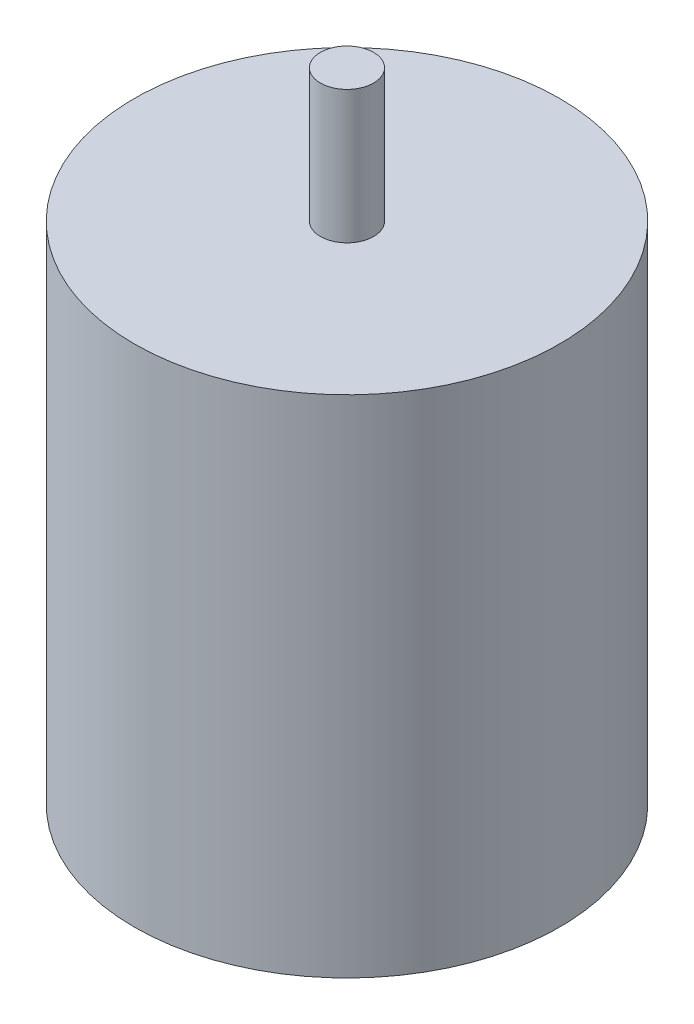
ISO-10303-21;
HEADER;
FILE_DESCRIPTION(('STEP AP214'),'2;1');
FILE_NAME('part.step','',(''),(''),'','','');
FILE_SCHEMA(('AUTOMOTIVE_DESIGN { 1 0 10303 214 1 1 1 1 }'));
ENDSEC;
DATA;
#1=APPLICATION_CONTEXT('core data for automotive mechanical design processes');
#2=APPLICATION_PROTOCOL_DEFINITION('international standard','automotive_design',2000,#1);
#3=PRODUCT_CONTEXT('',#1,'mechanical');
#4=PRODUCT('Part','Part','',(#3));
#5=PRODUCT_RELATED_PRODUCT_CATEGORY('part','',(#4));
#6=PRODUCT_DEFINITION_FORMATION('','',#4);
#7=PRODUCT_DEFINITION_CONTEXT('part definition',#1,'design');
#8=PRODUCT_DEFINITION('design','',#6,#7);
#9=PRODUCT_DEFINITION_SHAPE('','',#8);
#10=(LENGTH_UNIT() NAMED_UNIT(*) SI_UNIT(.MILLI.,.METRE.));
#11=(NAMED_UNIT(*) PLANE_ANGLE_UNIT() SI_UNIT($,.RADIAN.));
#12=(NAMED_UNIT(*) SI_UNIT($,.STERADIAN.) SOLID_ANGLE_UNIT());
#13=UNCERTAINTY_MEASURE_WITH_UNIT(LENGTH_MEASURE(1.E-05),#10,'distance_accuracy_value','');
#14=(GEOMETRIC_REPRESENTATION_CONTEXT(3) GLOBAL_UNCERTAINTY_ASSIGNED_CONTEXT((#13)) GLOBAL_UNIT_ASSIGNED_CONTEXT((#10,
#11,#12)) REPRESENTATION_CONTEXT('',''));
#15=CARTESIAN_POINT('',(0.,0.,0.));
#16=DIRECTION('',(0.,0.,1.));
#17=DIRECTION('',(1.,0.,0.));
#18=AXIS2_PLACEMENT_3D('',#15,#16,#17);
#19=CARTESIAN_POINT('',(0.,19.,0.));
#20=DIRECTION('',(0.,-1.,0.));
#21=DIRECTION('',(0.,0.,-1.));
#22=AXIS2_PLACEMENT_3D('',#19,#20,#21);
#23=CYLINDRICAL_SURFACE('',#22,8.);
#24=CARTESIAN_POINT('',(0.,19.,0.));
#25=DIRECTION('',(0.,1.,0.));
#26=DIRECTION('',(0.,0.,1.));
#27=AXIS2_PLACEMENT_3D('',#24,#25,#26);
#28=CIRCLE('',#27,8.);
#29=CARTESIAN_POINT('',(0.,19.,8.));
#30=VERTEX_POINT('',#29);
#31=EDGE_CURVE('E10',#30,#30,#28,.T.);
#32=ORIENTED_EDGE('',*,*,#31,.F.);
#33=EDGE_LOOP('',(#32));
#34=FACE_BOUND('',#33,.T.);
#35=CARTESIAN_POINT('',(0.,0.,0.));
#36=DIRECTION('',(0.,1.,0.));
#37=DIRECTION('',(0.,0.,1.));
#38=AXIS2_PLACEMENT_3D('',#35,#36,#37);
#39=CIRCLE('',#38,8.);
#40=CARTESIAN_POINT('',(0.,0.,8.));
#41=VERTEX_POINT('',#40);
#42=EDGE_CURVE('E37',#41,#41,#39,.T.);
#43=ORIENTED_EDGE('',*,*,#42,.T.);
#44=EDGE_LOOP('',(#43));
#45=FACE_BOUND('',#44,.T.);
#46=ADVANCED_FACE('F40',(#34,#45),#23,.T.);
#47=CARTESIAN_POINT('',(0.,19.,0.));
#48=DIRECTION('',(0.,1.,0.));
#49=DIRECTION('',(0.,0.,1.));
#50=AXIS2_PLACEMENT_3D('',#47,#48,#49);
#51=PLANE('',#50);
#52=CARTESIAN_POINT('',(0.,19.,0.));
#53=DIRECTION('',(0.,1.,0.));
#54=DIRECTION('',(0.,0.,1.));
#55=AXIS2_PLACEMENT_3D('',#52,#53,#54);
#56=CIRCLE('',#55,1.);
#57=CARTESIAN_POINT('',(0.,19.,1.));
#58=VERTEX_POINT('',#57);
#59=EDGE_CURVE('E47',#58,#58,#56,.T.);
#60=ORIENTED_EDGE('',*,*,#59,.F.);
#61=EDGE_LOOP('',(#60));
#62=FACE_BOUND('',#61,.T.);
#63=ORIENTED_EDGE('',*,*,#31,.T.);
#64=EDGE_LOOP('',(#63));
#65=FACE_BOUND('',#64,.T.);
#66=ADVANCED_FACE('F63',(#62,#65),#51,.T.);
#67=CARTESIAN_POINT('',(0.,0.,0.));
#68=DIRECTION('',(0.,1.,0.));
#69=DIRECTION('',(0.,0.,1.));
#70=AXIS2_PLACEMENT_3D('',#67,#68,#69);
#71=PLANE('',#70);
#72=ORIENTED_EDGE('',*,*,#42,.F.);
#73=EDGE_LOOP('',(#72));
#74=FACE_BOUND('',#73,.T.);
#75=ADVANCED_FACE('F58',(#74),#71,.F.);
#76=CARTESIAN_POINT('',(0.,24.,0.));
#77=DIRECTION('',(0.,-1.,0.));
#78=DIRECTION('',(0.,0.,-1.));
#79=AXIS2_PLACEMENT_3D('',#76,#77,#78);
#80=CYLINDRICAL_SURFACE('',#79,1.);
#81=CARTESIAN_POINT('',(0.,24.,0.));
#82=DIRECTION('',(0.,1.,0.));
#83=DIRECTION('',(0.,0.,1.));
#84=AXIS2_PLACEMENT_3D('',#81,#82,#83);
#85=CIRCLE('',#84,1.);
#86=CARTESIAN_POINT('',(0.,24.,1.));
#87=VERTEX_POINT('',#86);
#88=EDGE_CURVE('E50',#87,#87,#85,.T.);
#89=ORIENTED_EDGE('',*,*,#88,.F.);
#90=EDGE_LOOP('',(#89));
#91=FACE_BOUND('',#90,.T.);
#92=ORIENTED_EDGE('',*,*,#59,.T.);
#93=EDGE_LOOP('',(#92));
#94=FACE_BOUND('',#93,.T.);
#95=ADVANCED_FACE('F60',(#91,#94),#80,.T.);
#96=CARTESIAN_POINT('',(0.,24.,0.));
#97=DIRECTION('',(0.,1.,0.));
#98=DIRECTION('',(0.,0.,1.));
#99=AXIS2_PLACEMENT_3D('',#96,#97,#98);
#100=PLANE('',#99);
#101=ORIENTED_EDGE('',*,*,#88,.T.);
#102=EDGE_LOOP('',(#101));
#103=FACE_BOUND('',#102,.T.);
#104=ADVANCED_FACE('F54',(#103),#100,.T.);
#105=CLOSED_SHELL('',(#46,#66,#75,#95,#104));
#106=MANIFOLD_SOLID_BREP('B2',#105);
#107=ADVANCED_BREP_SHAPE_REPRESENTATION('',(#18,#106),#14);
#108=SHAPE_DEFINITION_REPRESENTATION(#9,#107);
ENDSEC;
END-ISO-10303-21;
